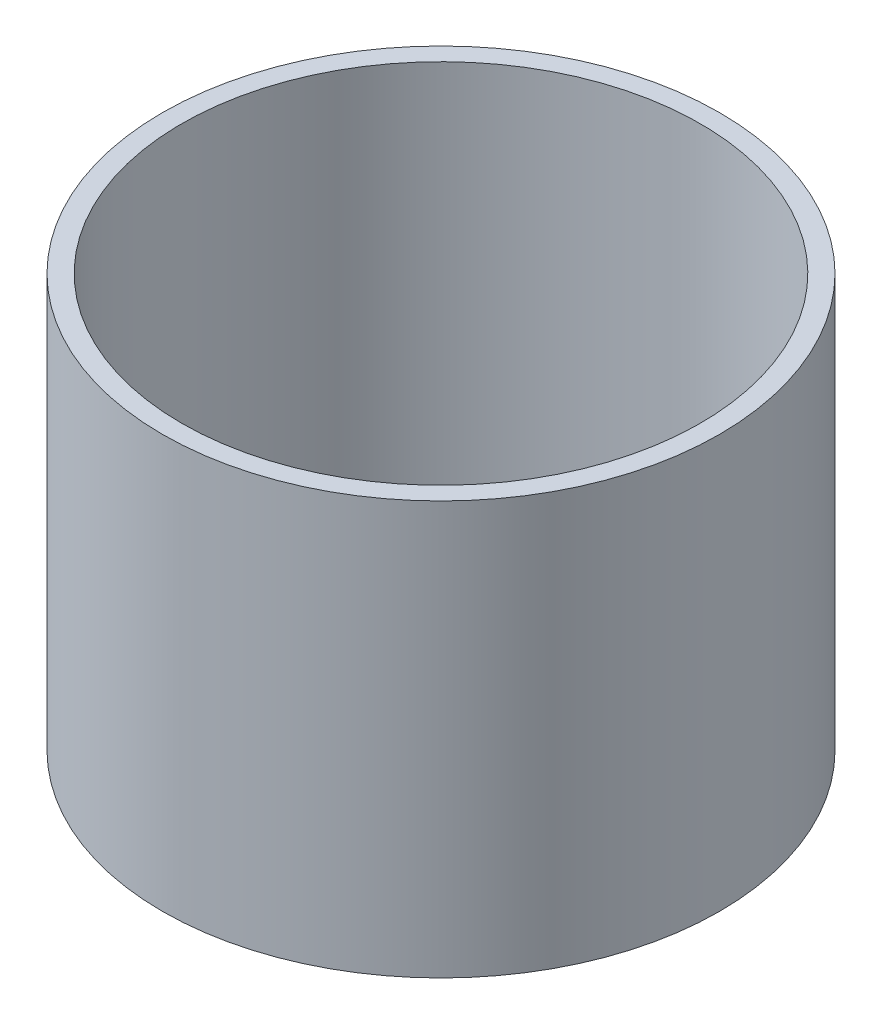
ISO-10303-21;
HEADER;
FILE_DESCRIPTION(('STEP AP214'),'2;1');
FILE_NAME('part.step','',(''),(''),'','','');
FILE_SCHEMA(('AUTOMOTIVE_DESIGN { 1 0 10303 214 1 1 1 1 }'));
ENDSEC;
DATA;
#1=APPLICATION_CONTEXT('core data for automotive mechanical design processes');
#2=APPLICATION_PROTOCOL_DEFINITION('international standard','automotive_design',2000,#1);
#3=PRODUCT_CONTEXT('',#1,'mechanical');
#4=PRODUCT('Part','Part','',(#3));
#5=PRODUCT_RELATED_PRODUCT_CATEGORY('part','',(#4));
#6=PRODUCT_DEFINITION_FORMATION('','',#4);
#7=PRODUCT_DEFINITION_CONTEXT('part definition',#1,'design');
#8=PRODUCT_DEFINITION('design','',#6,#7);
#9=PRODUCT_DEFINITION_SHAPE('','',#8);
#10=(LENGTH_UNIT() NAMED_UNIT(*) SI_UNIT(.MILLI.,.METRE.));
#11=(NAMED_UNIT(*) PLANE_ANGLE_UNIT() SI_UNIT($,.RADIAN.));
#12=(NAMED_UNIT(*) SI_UNIT($,.STERADIAN.) SOLID_ANGLE_UNIT());
#13=UNCERTAINTY_MEASURE_WITH_UNIT(LENGTH_MEASURE(1.E-05),#10,'distance_accuracy_value','');
#14=(GEOMETRIC_REPRESENTATION_CONTEXT(3) GLOBAL_UNCERTAINTY_ASSIGNED_CONTEXT((#13)) GLOBAL_UNIT_ASSIGNED_CONTEXT((#10,
#11,#12)) REPRESENTATION_CONTEXT('',''));
#15=CARTESIAN_POINT('',(0.,0.,0.));
#16=DIRECTION('',(0.,0.,1.));
#17=DIRECTION('',(1.,0.,0.));
#18=AXIS2_PLACEMENT_3D('',#15,#16,#17);
#19=CARTESIAN_POINT('',(0.,104.14,0.));
#20=DIRECTION('',(0.,1.,0.));
#21=DIRECTION('',(0.,0.,1.));
#22=AXIS2_PLACEMENT_3D('',#19,#20,#21);
#23=PLANE('',#22);
#24=CARTESIAN_POINT('',(0.,104.14,0.));
#25=DIRECTION('',(0.,1.,0.));
#26=DIRECTION('',(0.,0.,1.));
#27=AXIS2_PLACEMENT_3D('',#24,#25,#26);
#28=CIRCLE('',#27,73.66);
#29=CARTESIAN_POINT('',(0.,104.14,73.66));
#30=VERTEX_POINT('',#29);
#31=EDGE_CURVE('E10',#30,#30,#28,.T.);
#32=ORIENTED_EDGE('',*,*,#31,.T.);
#33=EDGE_LOOP('',(#32));
#34=FACE_BOUND('',#33,.T.);
#35=CARTESIAN_POINT('',(0.,104.14,0.));
#36=DIRECTION('',(0.,1.,0.));
#37=DIRECTION('',(0.,0.,1.));
#38=AXIS2_PLACEMENT_3D('',#35,#36,#37);
#39=CIRCLE('',#38,68.58);
#40=CARTESIAN_POINT('',(0.,104.14,68.58));
#41=VERTEX_POINT('',#40);
#42=EDGE_CURVE('E42',#41,#41,#39,.T.);
#43=ORIENTED_EDGE('',*,*,#42,.F.);
#44=EDGE_LOOP('',(#43));
#45=FACE_BOUND('',#44,.T.);
#46=ADVANCED_FACE('F35',(#34,#45),#23,.T.);
#47=CARTESIAN_POINT('',(0.,104.14,0.));
#48=DIRECTION('',(0.,-1.,0.));
#49=DIRECTION('',(0.,0.,-1.));
#50=AXIS2_PLACEMENT_3D('',#47,#48,#49);
#51=CYLINDRICAL_SURFACE('',#50,73.66);
#52=ORIENTED_EDGE('',*,*,#31,.F.);
#53=EDGE_LOOP('',(#52));
#54=FACE_BOUND('',#53,.T.);
#55=CARTESIAN_POINT('',(0.,-5.08,0.));
#56=DIRECTION('',(0.,-1.,0.));
#57=DIRECTION('',(0.,0.,-1.));
#58=AXIS2_PLACEMENT_3D('',#55,#56,#57);
#59=CIRCLE('',#58,73.66);
#60=CARTESIAN_POINT('',(0.,-5.08,-73.66));
#61=VERTEX_POINT('',#60);
#62=EDGE_CURVE('E51',#61,#61,#59,.T.);
#63=ORIENTED_EDGE('',*,*,#62,.F.);
#64=EDGE_LOOP('',(#63));
#65=FACE_BOUND('',#64,.T.);
#66=ADVANCED_FACE('F37',(#54,#65),#51,.T.);
#67=CARTESIAN_POINT('',(0.,104.14,0.));
#68=DIRECTION('',(0.,-1.,0.));
#69=DIRECTION('',(0.,0.,-1.));
#70=AXIS2_PLACEMENT_3D('',#67,#68,#69);
#71=CYLINDRICAL_SURFACE('',#70,68.58);
#72=ORIENTED_EDGE('',*,*,#42,.T.);
#73=EDGE_LOOP('',(#72));
#74=FACE_BOUND('',#73,.T.);
#75=CARTESIAN_POINT('',(0.,0.,0.));
#76=DIRECTION('',(0.,1.,0.));
#77=DIRECTION('',(0.,0.,1.));
#78=AXIS2_PLACEMENT_3D('',#75,#76,#77);
#79=CIRCLE('',#78,68.58);
#80=CARTESIAN_POINT('',(0.,0.,68.58));
#81=VERTEX_POINT('',#80);
#82=EDGE_CURVE('E46',#81,#81,#79,.T.);
#83=ORIENTED_EDGE('',*,*,#82,.F.);
#84=EDGE_LOOP('',(#83));
#85=FACE_BOUND('',#84,.T.);
#86=ADVANCED_FACE('F96',(#74,#85),#71,.F.);
#87=CARTESIAN_POINT('',(0.,0.,0.));
#88=DIRECTION('',(0.,-1.,0.));
#89=DIRECTION('',(0.,0.,-1.));
#90=AXIS2_PLACEMENT_3D('',#87,#88,#89);
#91=PLANE('',#90);
#92=CARTESIAN_POINT('',(-48.2599999999986,0.,-1.36867662438496E-12));
#93=DIRECTION('',(0.,-1.,0.));
#94=DIRECTION('',(0.,0.,-1.));
#95=AXIS2_PLACEMENT_3D('',#92,#93,#94);
#96=CIRCLE('',#95,3.37820000000219);
#97=CARTESIAN_POINT('',(-48.2599999999986,0.,-3.37820000000356));
#98=VERTEX_POINT('',#97);
#99=EDGE_CURVE('E74',#98,#98,#96,.T.);
#100=ORIENTED_EDGE('',*,*,#99,.T.);
#101=EDGE_LOOP('',(#100));
#102=FACE_BOUND('',#101,.T.);
#103=CARTESIAN_POINT('',(2.72553295786454E-12,0.,-48.26));
#104=DIRECTION('',(0.,-1.,0.));
#105=DIRECTION('',(0.,0.,-1.));
#106=AXIS2_PLACEMENT_3D('',#103,#104,#105);
#107=CIRCLE('',#106,3.37820000000293);
#108=CARTESIAN_POINT('',(2.72553295786454E-12,0.,-51.6382000000029));
#109=VERTEX_POINT('',#108);
#110=EDGE_CURVE('E68',#109,#109,#107,.T.);
#111=ORIENTED_EDGE('',*,*,#110,.T.);
#112=EDGE_LOOP('',(#111));
#113=FACE_BOUND('',#112,.T.);
#114=CARTESIAN_POINT('',(48.2600000000014,0.,1.36276647893227E-12));
#115=DIRECTION('',(0.,-1.,0.));
#116=DIRECTION('',(0.,0.,-1.));
#117=AXIS2_PLACEMENT_3D('',#114,#115,#116);
#118=CIRCLE('',#117,3.37820000000107);
#119=CARTESIAN_POINT('',(48.2600000000014,0.,-3.37819999999971));
#120=VERTEX_POINT('',#119);
#121=EDGE_CURVE('E62',#120,#120,#118,.T.);
#122=ORIENTED_EDGE('',*,*,#121,.T.);
#123=EDGE_LOOP('',(#122));
#124=FACE_BOUND('',#123,.T.);
#125=CARTESIAN_POINT('',(0.,0.,48.26));
#126=DIRECTION('',(0.,-1.,0.));
#127=DIRECTION('',(0.,0.,-1.));
#128=AXIS2_PLACEMENT_3D('',#125,#126,#127);
#129=CIRCLE('',#128,3.3782);
#130=CARTESIAN_POINT('',(0.,0.,44.8818));
#131=VERTEX_POINT('',#130);
#132=EDGE_CURVE('E56',#131,#131,#129,.T.);
#133=ORIENTED_EDGE('',*,*,#132,.T.);
#134=EDGE_LOOP('',(#133));
#135=FACE_BOUND('',#134,.T.);
#136=ORIENTED_EDGE('',*,*,#82,.T.);
#137=EDGE_LOOP('',(#136));
#138=FACE_BOUND('',#137,.T.);
#139=ADVANCED_FACE('F86',(#102,#113,#124,#135,#138),#91,.F.);
#140=CARTESIAN_POINT('',(0.,-5.08,0.));
#141=DIRECTION('',(0.,-1.,0.));
#142=DIRECTION('',(0.,0.,-1.));
#143=AXIS2_PLACEMENT_3D('',#140,#141,#142);
#144=PLANE('',#143);
#145=CARTESIAN_POINT('',(2.72553295786454E-12,-5.08,-48.26));
#146=DIRECTION('',(0.,-1.,0.));
#147=DIRECTION('',(0.,0.,-1.));
#148=AXIS2_PLACEMENT_3D('',#145,#146,#147);
#149=CIRCLE('',#148,3.37820000000293);
#150=CARTESIAN_POINT('',(2.72553295786454E-12,-5.08,-51.6382000000029));
#151=VERTEX_POINT('',#150);
#152=EDGE_CURVE('E65',#151,#151,#149,.T.);
#153=ORIENTED_EDGE('',*,*,#152,.F.);
#154=EDGE_LOOP('',(#153));
#155=FACE_BOUND('',#154,.T.);
#156=CARTESIAN_POINT('',(0.,-5.08,48.26));
#157=DIRECTION('',(0.,-1.,0.));
#158=DIRECTION('',(0.,0.,-1.));
#159=AXIS2_PLACEMENT_3D('',#156,#157,#158);
#160=CIRCLE('',#159,3.3782);
#161=CARTESIAN_POINT('',(0.,-5.08,44.8818));
#162=VERTEX_POINT('',#161);
#163=EDGE_CURVE('E55',#162,#162,#160,.T.);
#164=ORIENTED_EDGE('',*,*,#163,.F.);
#165=EDGE_LOOP('',(#164));
#166=FACE_BOUND('',#165,.T.);
#167=ORIENTED_EDGE('',*,*,#62,.T.);
#168=EDGE_LOOP('',(#167));
#169=FACE_BOUND('',#168,.T.);
#170=CARTESIAN_POINT('',(48.2600000000014,-5.08,1.36276647893227E-12));
#171=DIRECTION('',(0.,-1.,0.));
#172=DIRECTION('',(0.,0.,-1.));
#173=AXIS2_PLACEMENT_3D('',#170,#171,#172);
#174=CIRCLE('',#173,3.37820000000107);
#175=CARTESIAN_POINT('',(48.2600000000014,-5.08,-3.37819999999971));
#176=VERTEX_POINT('',#175);
#177=EDGE_CURVE('E59',#176,#176,#174,.T.);
#178=ORIENTED_EDGE('',*,*,#177,.F.);
#179=EDGE_LOOP('',(#178));
#180=FACE_BOUND('',#179,.T.);
#181=CARTESIAN_POINT('',(-48.2599999999986,-5.08,-1.36867662438496E-12));
#182=DIRECTION('',(0.,-1.,0.));
#183=DIRECTION('',(0.,0.,-1.));
#184=AXIS2_PLACEMENT_3D('',#181,#182,#183);
#185=CIRCLE('',#184,3.37820000000219);
#186=CARTESIAN_POINT('',(-48.2599999999986,-5.08,-3.37820000000356));
#187=VERTEX_POINT('',#186);
#188=EDGE_CURVE('E71',#187,#187,#185,.T.);
#189=ORIENTED_EDGE('',*,*,#188,.F.);
#190=EDGE_LOOP('',(#189));
#191=FACE_BOUND('',#190,.T.);
#192=ADVANCED_FACE('F83',(#155,#166,#169,#180,#191),#144,.T.);
#193=CARTESIAN_POINT('',(0.,-5.08,48.26));
#194=DIRECTION('',(0.,1.,0.));
#195=DIRECTION('',(0.,0.,1.));
#196=AXIS2_PLACEMENT_3D('',#193,#194,#195);
#197=CYLINDRICAL_SURFACE('',#196,3.3782);
#198=ORIENTED_EDGE('',*,*,#163,.T.);
#199=EDGE_LOOP('',(#198));
#200=FACE_BOUND('',#199,.T.);
#201=ORIENTED_EDGE('',*,*,#132,.F.);
#202=EDGE_LOOP('',(#201));
#203=FACE_BOUND('',#202,.T.);
#204=ADVANCED_FACE('F85',(#200,#203),#197,.F.);
#205=CARTESIAN_POINT('',(48.2600000000014,-5.08,1.36276647893227E-12));
#206=DIRECTION('',(0.,1.,0.));
#207=DIRECTION('',(0.,0.,1.));
#208=AXIS2_PLACEMENT_3D('',#205,#206,#207);
#209=CYLINDRICAL_SURFACE('',#208,3.37820000000107);
#210=ORIENTED_EDGE('',*,*,#177,.T.);
#211=EDGE_LOOP('',(#210));
#212=FACE_BOUND('',#211,.T.);
#213=ORIENTED_EDGE('',*,*,#121,.F.);
#214=EDGE_LOOP('',(#213));
#215=FACE_BOUND('',#214,.T.);
#216=ADVANCED_FACE('F93',(#212,#215),#209,.F.);
#217=CARTESIAN_POINT('',(2.72553295786454E-12,-5.08,-48.26));
#218=DIRECTION('',(0.,1.,0.));
#219=DIRECTION('',(0.,0.,1.));
#220=AXIS2_PLACEMENT_3D('',#217,#218,#219);
#221=CYLINDRICAL_SURFACE('',#220,3.37820000000293);
#222=ORIENTED_EDGE('',*,*,#152,.T.);
#223=EDGE_LOOP('',(#222));
#224=FACE_BOUND('',#223,.T.);
#225=ORIENTED_EDGE('',*,*,#110,.F.);
#226=EDGE_LOOP('',(#225));
#227=FACE_BOUND('',#226,.T.);
#228=ADVANCED_FACE('F144',(#224,#227),#221,.F.);
#229=CARTESIAN_POINT('',(-48.2599999999986,-5.08,-1.36867662438496E-12));
#230=DIRECTION('',(0.,1.,0.));
#231=DIRECTION('',(0.,0.,1.));
#232=AXIS2_PLACEMENT_3D('',#229,#230,#231);
#233=CYLINDRICAL_SURFACE('',#232,3.37820000000219);
#234=ORIENTED_EDGE('',*,*,#188,.T.);
#235=EDGE_LOOP('',(#234));
#236=FACE_BOUND('',#235,.T.);
#237=ORIENTED_EDGE('',*,*,#99,.F.);
#238=EDGE_LOOP('',(#237));
#239=FACE_BOUND('',#238,.T.);
#240=ADVANCED_FACE('F80',(#236,#239),#233,.F.);
#241=CLOSED_SHELL('',(#46,#66,#86,#139,#192,#204,#216,#228,#240));
#242=MANIFOLD_SOLID_BREP('B2',#241);
#243=ADVANCED_BREP_SHAPE_REPRESENTATION('',(#18,#242),#14);
#244=SHAPE_DEFINITION_REPRESENTATION(#9,#243);
ENDSEC;
END-ISO-10303-21;
